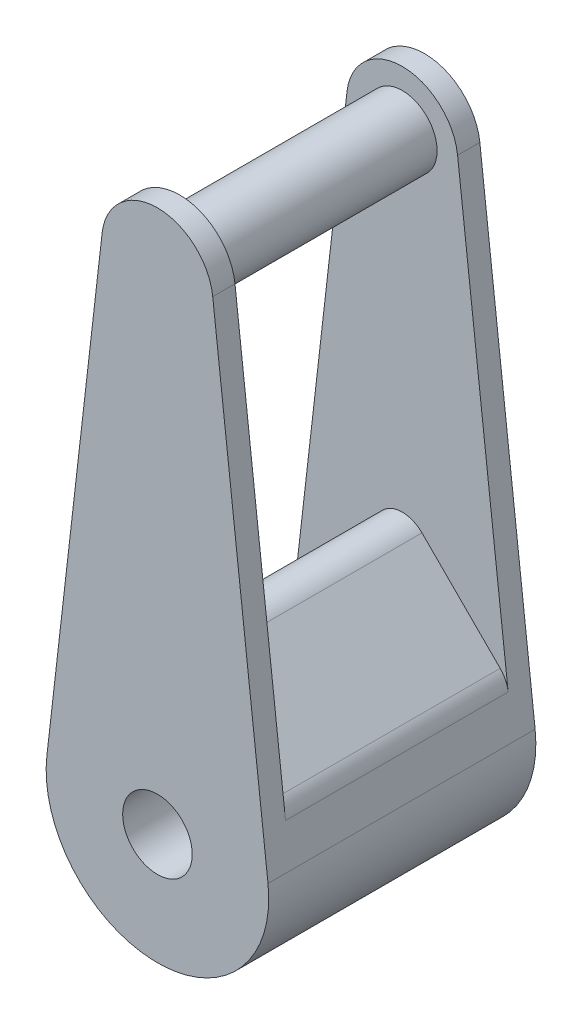
ISO-10303-21;
HEADER;
FILE_DESCRIPTION(('STEP AP214'),'2;1');
FILE_NAME('part.step','',(''),(''),'','','');
FILE_SCHEMA(('AUTOMOTIVE_DESIGN { 1 0 10303 214 1 1 1 1 }'));
ENDSEC;
DATA;
#1=APPLICATION_CONTEXT('core data for automotive mechanical design processes');
#2=APPLICATION_PROTOCOL_DEFINITION('international standard','automotive_design',2000,#1);
#3=PRODUCT_CONTEXT('',#1,'mechanical');
#4=PRODUCT('Part','Part','',(#3));
#5=PRODUCT_RELATED_PRODUCT_CATEGORY('part','',(#4));
#6=PRODUCT_DEFINITION_FORMATION('','',#4);
#7=PRODUCT_DEFINITION_CONTEXT('part definition',#1,'design');
#8=PRODUCT_DEFINITION('design','',#6,#7);
#9=PRODUCT_DEFINITION_SHAPE('','',#8);
#10=(LENGTH_UNIT() NAMED_UNIT(*) SI_UNIT(.MILLI.,.METRE.));
#11=(NAMED_UNIT(*) PLANE_ANGLE_UNIT() SI_UNIT($,.RADIAN.));
#12=(NAMED_UNIT(*) SI_UNIT($,.STERADIAN.) SOLID_ANGLE_UNIT());
#13=UNCERTAINTY_MEASURE_WITH_UNIT(LENGTH_MEASURE(1.E-05),#10,'distance_accuracy_value','');
#14=(GEOMETRIC_REPRESENTATION_CONTEXT(3) GLOBAL_UNCERTAINTY_ASSIGNED_CONTEXT((#13)) GLOBAL_UNIT_ASSIGNED_CONTEXT((#10,
#11,#12)) REPRESENTATION_CONTEXT('',''));
#15=CARTESIAN_POINT('',(0.,0.,0.));
#16=DIRECTION('',(0.,0.,1.));
#17=DIRECTION('',(1.,0.,0.));
#18=AXIS2_PLACEMENT_3D('',#15,#16,#17);
#19=CARTESIAN_POINT('',(0.,0.,40.));
#20=DIRECTION('',(0.,0.,1.));
#21=DIRECTION('',(1.,0.,0.));
#22=AXIS2_PLACEMENT_3D('',#19,#20,#21);
#23=PLANE('',#22);
#24=CARTESIAN_POINT('',(0.,0.,40.));
#25=DIRECTION('',(0.,0.,1.));
#26=DIRECTION('',(1.,0.,0.));
#27=AXIS2_PLACEMENT_3D('',#24,#25,#26);
#28=CIRCLE('',#27,12.5);
#29=CARTESIAN_POINT('',(12.5,0.,40.));
#30=VERTEX_POINT('',#29);
#31=EDGE_CURVE('E11',#30,#30,#28,.T.);
#32=ORIENTED_EDGE('',*,*,#31,.T.);
#33=EDGE_LOOP('',(#32));
#34=FACE_BOUND('',#33,.T.);
#35=CARTESIAN_POINT('',(-28.1068870206755,-156.823874635897,40.));
#36=DIRECTION('',(0.,0.,1.));
#37=DIRECTION('',(1.,0.,0.));
#38=AXIS2_PLACEMENT_3D('',#35,#36,#37);
#39=CIRCLE('',#38,10.);
#40=CARTESIAN_POINT('',(-35.1779548325411,-149.752806824032,40.));
#41=VERTEX_POINT('',#40);
#42=CARTESIAN_POINT('',(-38.0413662496548,-155.68101749304,40.));
#43=VERTEX_POINT('',#42);
#44=EDGE_CURVE('E132',#41,#43,#39,.T.);
#45=ORIENTED_EDGE('',*,*,#44,.T.);
#46=DIRECTION('',(-0.114285714285714,-0.993447922897926,0.));
#47=VECTOR('',#46,1.);
#48=CARTESIAN_POINT('',(-19.8689584579585,2.28571428571428,40.));
#49=LINE('',#48,#47);
#50=CARTESIAN_POINT('',(-19.8689584579585,2.28571428571428,40.));
#51=VERTEX_POINT('',#50);
#52=EDGE_CURVE('E204',#51,#43,#49,.T.);
#53=ORIENTED_EDGE('',*,*,#52,.F.);
#54=CARTESIAN_POINT('',(0.,0.,40.));
#55=DIRECTION('',(0.,0.,1.));
#56=DIRECTION('',(1.,0.,0.));
#57=AXIS2_PLACEMENT_3D('',#54,#55,#56);
#58=CIRCLE('',#57,20.);
#59=CARTESIAN_POINT('',(19.8689584579585,2.28571428571429,40.));
#60=VERTEX_POINT('',#59);
#61=EDGE_CURVE('E201',#60,#51,#58,.T.);
#62=ORIENTED_EDGE('',*,*,#61,.F.);
#63=DIRECTION('',(0.114285714285714,-0.993447922897926,0.));
#64=VECTOR('',#63,1.);
#65=CARTESIAN_POINT('',(19.8689584579585,2.28571428571429,40.));
#66=LINE('',#65,#64);
#67=CARTESIAN_POINT('',(38.0413662496548,-155.68101749304,40.));
#68=VERTEX_POINT('',#67);
#69=EDGE_CURVE('E127',#60,#68,#66,.T.);
#70=ORIENTED_EDGE('',*,*,#69,.T.);
#71=CARTESIAN_POINT('',(28.1068870206755,-156.823874635897,40.));
#72=DIRECTION('',(0.,0.,1.));
#73=DIRECTION('',(1.,0.,0.));
#74=AXIS2_PLACEMENT_3D('',#71,#72,#73);
#75=CIRCLE('',#74,10.);
#76=CARTESIAN_POINT('',(35.1779548325411,-149.752806824032,40.));
#77=VERTEX_POINT('',#76);
#78=EDGE_CURVE('E120',#68,#77,#75,.T.);
#79=ORIENTED_EDGE('',*,*,#78,.T.);
#80=DIRECTION('',(-0.707106781186542,0.707106781186553,0.));
#81=VECTOR('',#80,1.);
#82=CARTESIAN_POINT('',(7.07106781186553,-121.645919803356,40.));
#83=LINE('',#82,#81);
#84=CARTESIAN_POINT('',(7.07106781186555,-121.645919803356,40.));
#85=VERTEX_POINT('',#84);
#86=EDGE_CURVE('E123',#77,#85,#83,.T.);
#87=ORIENTED_EDGE('',*,*,#86,.T.);
#88=CARTESIAN_POINT('',(0.,-128.716987615221,40.));
#89=DIRECTION('',(0.,0.,1.));
#90=DIRECTION('',(1.,0.,0.));
#91=AXIS2_PLACEMENT_3D('',#88,#89,#90);
#92=CIRCLE('',#91,9.99999999999999);
#93=CARTESIAN_POINT('',(-7.07106781186553,-121.645919803356,40.));
#94=VERTEX_POINT('',#93);
#95=EDGE_CURVE('E55',#85,#94,#92,.T.);
#96=ORIENTED_EDGE('',*,*,#95,.T.);
#97=DIRECTION('',(-0.707106781186541,-0.707106781186554,0.));
#98=VECTOR('',#97,1.);
#99=CARTESIAN_POINT('',(-7.07106781186553,-121.645919803356,40.));
#100=LINE('',#99,#98);
#101=EDGE_CURVE('E50',#94,#41,#100,.T.);
#102=ORIENTED_EDGE('',*,*,#101,.T.);
#103=EDGE_LOOP('',(#45,#53,#62,#70,#79,#87,#96,#102));
#104=FACE_BOUND('',#103,.T.);
#105=ADVANCED_FACE('F34',(#34,#104),#23,.F.);
#106=CARTESIAN_POINT('',(0.,0.,-40.));
#107=DIRECTION('',(0.,0.,-1.));
#108=DIRECTION('',(1.,0.,0.));
#109=AXIS2_PLACEMENT_3D('',#106,#107,#108);
#110=PLANE('',#109);
#111=CARTESIAN_POINT('',(0.,0.,-40.));
#112=DIRECTION('',(0.,0.,1.));
#113=DIRECTION('',(1.,0.,0.));
#114=AXIS2_PLACEMENT_3D('',#111,#112,#113);
#115=CIRCLE('',#114,12.5);
#116=CARTESIAN_POINT('',(12.5,0.,-40.));
#117=VERTEX_POINT('',#116);
#118=EDGE_CURVE('E38',#117,#117,#115,.T.);
#119=ORIENTED_EDGE('',*,*,#118,.F.);
#120=EDGE_LOOP('',(#119));
#121=FACE_BOUND('',#120,.T.);
#122=CARTESIAN_POINT('',(-28.1068870206755,-156.823874635897,-40.));
#123=DIRECTION('',(0.,0.,1.));
#124=DIRECTION('',(-1.,0.,0.));
#125=AXIS2_PLACEMENT_3D('',#122,#123,#124);
#126=CIRCLE('',#125,10.);
#127=CARTESIAN_POINT('',(-35.1779548325411,-149.752806824032,-40.));
#128=VERTEX_POINT('',#127);
#129=CARTESIAN_POINT('',(-38.0413662496548,-155.68101749304,-40.));
#130=VERTEX_POINT('',#129);
#131=EDGE_CURVE('E159',#128,#130,#126,.T.);
#132=ORIENTED_EDGE('',*,*,#131,.F.);
#133=DIRECTION('',(-0.707106781186541,-0.707106781186554,0.));
#134=VECTOR('',#133,1.);
#135=CARTESIAN_POINT('',(-7.07106781186553,-121.645919803356,-40.));
#136=LINE('',#135,#134);
#137=CARTESIAN_POINT('',(-7.07106781186553,-121.645919803356,-40.));
#138=VERTEX_POINT('',#137);
#139=EDGE_CURVE('E154',#138,#128,#136,.T.);
#140=ORIENTED_EDGE('',*,*,#139,.F.);
#141=CARTESIAN_POINT('',(0.,-128.716987615221,-40.));
#142=DIRECTION('',(0.,0.,1.));
#143=DIRECTION('',(1.,0.,0.));
#144=AXIS2_PLACEMENT_3D('',#141,#142,#143);
#145=CIRCLE('',#144,9.99999999999999);
#146=CARTESIAN_POINT('',(7.07106781186553,-121.645919803356,-40.));
#147=VERTEX_POINT('',#146);
#148=EDGE_CURVE('E155',#147,#138,#145,.T.);
#149=ORIENTED_EDGE('',*,*,#148,.F.);
#150=DIRECTION('',(-0.707106781186542,0.707106781186553,0.));
#151=VECTOR('',#150,1.);
#152=CARTESIAN_POINT('',(7.07106781186553,-121.645919803356,-40.));
#153=LINE('',#152,#151);
#154=CARTESIAN_POINT('',(35.1779548325411,-149.752806824032,-40.));
#155=VERTEX_POINT('',#154);
#156=EDGE_CURVE('E141',#155,#147,#153,.T.);
#157=ORIENTED_EDGE('',*,*,#156,.F.);
#158=CARTESIAN_POINT('',(28.1068870206755,-156.823874635897,-40.));
#159=DIRECTION('',(0.,0.,1.));
#160=DIRECTION('',(1.,0.,0.));
#161=AXIS2_PLACEMENT_3D('',#158,#159,#160);
#162=CIRCLE('',#161,10.);
#163=CARTESIAN_POINT('',(38.0413662496548,-155.68101749304,-40.));
#164=VERTEX_POINT('',#163);
#165=EDGE_CURVE('E138',#164,#155,#162,.T.);
#166=ORIENTED_EDGE('',*,*,#165,.F.);
#167=DIRECTION('',(0.114285714285714,-0.993447922897926,0.));
#168=VECTOR('',#167,1.);
#169=CARTESIAN_POINT('',(19.8689584579585,2.28571428571429,-40.));
#170=LINE('',#169,#168);
#171=CARTESIAN_POINT('',(19.8689584579585,2.28571428571429,-40.));
#172=VERTEX_POINT('',#171);
#173=EDGE_CURVE('E183',#172,#164,#170,.T.);
#174=ORIENTED_EDGE('',*,*,#173,.F.);
#175=CARTESIAN_POINT('',(0.,0.,-40.));
#176=DIRECTION('',(0.,0.,1.));
#177=DIRECTION('',(1.,0.,0.));
#178=AXIS2_PLACEMENT_3D('',#175,#176,#177);
#179=CIRCLE('',#178,20.);
#180=CARTESIAN_POINT('',(-19.8689584579585,2.28571428571428,-40.));
#181=VERTEX_POINT('',#180);
#182=EDGE_CURVE('E131',#172,#181,#179,.T.);
#183=ORIENTED_EDGE('',*,*,#182,.T.);
#184=DIRECTION('',(-0.114285714285714,-0.993447922897926,0.));
#185=VECTOR('',#184,1.);
#186=CARTESIAN_POINT('',(-19.8689584579585,2.28571428571428,-40.));
#187=LINE('',#186,#185);
#188=EDGE_CURVE('E171',#181,#130,#187,.T.);
#189=ORIENTED_EDGE('',*,*,#188,.T.);
#190=EDGE_LOOP('',(#132,#140,#149,#157,#166,#174,#183,#189));
#191=FACE_BOUND('',#190,.T.);
#192=ADVANCED_FACE('F228',(#121,#191),#110,.F.);
#193=CARTESIAN_POINT('',(0.,0.,40.));
#194=DIRECTION('',(0.,0.,-1.));
#195=DIRECTION('',(-1.,0.,0.));
#196=AXIS2_PLACEMENT_3D('',#193,#194,#195);
#197=CYLINDRICAL_SURFACE('',#196,12.5);
#198=ORIENTED_EDGE('',*,*,#31,.F.);
#199=EDGE_LOOP('',(#198));
#200=FACE_BOUND('',#199,.T.);
#201=ORIENTED_EDGE('',*,*,#118,.T.);
#202=EDGE_LOOP('',(#201));
#203=FACE_BOUND('',#202,.T.);
#204=ADVANCED_FACE('F36',(#200,#203),#197,.T.);
#205=CARTESIAN_POINT('',(0.,0.,48.));
#206=DIRECTION('',(0.,0.,-1.));
#207=DIRECTION('',(-1.,0.,0.));
#208=AXIS2_PLACEMENT_3D('',#205,#206,#207);
#209=CYLINDRICAL_SURFACE('',#208,20.);
#210=ORIENTED_EDGE('',*,*,#61,.T.);
#211=DIRECTION('',(0.,0.,-1.));
#212=VECTOR('',#211,1.);
#213=CARTESIAN_POINT('',(-19.8689584579585,2.28571428571428,48.));
#214=LINE('',#213,#212);
#215=CARTESIAN_POINT('',(-19.8689584579585,2.28571428571428,48.));
#216=VERTEX_POINT('',#215);
#217=EDGE_CURVE('E43',#216,#51,#214,.T.);
#218=ORIENTED_EDGE('',*,*,#217,.F.);
#219=CARTESIAN_POINT('',(0.,0.,48.));
#220=DIRECTION('',(0.,0.,1.));
#221=DIRECTION('',(1.,0.,0.));
#222=AXIS2_PLACEMENT_3D('',#219,#220,#221);
#223=CIRCLE('',#222,20.);
#224=CARTESIAN_POINT('',(19.8689584579585,2.28571428571429,48.));
#225=VERTEX_POINT('',#224);
#226=EDGE_CURVE('E190',#225,#216,#223,.T.);
#227=ORIENTED_EDGE('',*,*,#226,.F.);
#228=DIRECTION('',(0.,0.,-1.));
#229=VECTOR('',#228,1.);
#230=CARTESIAN_POINT('',(19.8689584579585,2.28571428571429,48.));
#231=LINE('',#230,#229);
#232=EDGE_CURVE('E200',#225,#60,#231,.T.);
#233=ORIENTED_EDGE('',*,*,#232,.T.);
#234=EDGE_LOOP('',(#210,#218,#227,#233));
#235=FACE_BOUND('',#234,.T.);
#236=ADVANCED_FACE('F221',(#235),#209,.T.);
#237=CARTESIAN_POINT('',(-19.8689584579585,2.28571428571428,48.));
#238=DIRECTION('',(0.993447922897926,-0.114285714285714,0.));
#239=DIRECTION('',(0.114285714285714,0.993447922897926,0.));
#240=AXIS2_PLACEMENT_3D('',#237,#238,#239);
#241=PLANE('',#240);
#242=ORIENTED_EDGE('',*,*,#52,.T.);
#243=DIRECTION('',(0.,0.,-1.));
#244=VECTOR('',#243,1.);
#245=CARTESIAN_POINT('',(-38.0413662496548,-155.68101749304,165.181542065464));
#246=LINE('',#245,#244);
#247=EDGE_CURVE('E160',#43,#130,#246,.T.);
#248=ORIENTED_EDGE('',*,*,#247,.T.);
#249=ORIENTED_EDGE('',*,*,#188,.F.);
#250=DIRECTION('',(0.,0.,1.));
#251=VECTOR('',#250,1.);
#252=CARTESIAN_POINT('',(-19.8689584579585,2.28571428571428,-48.));
#253=LINE('',#252,#251);
#254=CARTESIAN_POINT('',(-19.8689584579585,2.28571428571428,-48.));
#255=VERTEX_POINT('',#254);
#256=EDGE_CURVE('E180',#255,#181,#253,.T.);
#257=ORIENTED_EDGE('',*,*,#256,.F.);
#258=DIRECTION('',(-0.114285714285714,-0.993447922897926,0.));
#259=VECTOR('',#258,1.);
#260=CARTESIAN_POINT('',(-19.8689584579585,2.28571428571428,-48.));
#261=LINE('',#260,#259);
#262=CARTESIAN_POINT('',(-39.737916915917,-170.428571428571,-48.));
#263=VERTEX_POINT('',#262);
#264=EDGE_CURVE('E177',#255,#263,#261,.T.);
#265=ORIENTED_EDGE('',*,*,#264,.T.);
#266=DIRECTION('',(0.,0.,-1.));
#267=VECTOR('',#266,1.);
#268=CARTESIAN_POINT('',(-39.737916915917,-170.428571428571,48.));
#269=LINE('',#268,#267);
#270=CARTESIAN_POINT('',(-39.737916915917,-170.428571428571,48.));
#271=VERTEX_POINT('',#270);
#272=EDGE_CURVE('E211',#271,#263,#269,.T.);
#273=ORIENTED_EDGE('',*,*,#272,.F.);
#274=DIRECTION('',(-0.114285714285714,-0.993447922897926,0.));
#275=VECTOR('',#274,1.);
#276=CARTESIAN_POINT('',(-19.8689584579585,2.28571428571428,48.));
#277=LINE('',#276,#275);
#278=EDGE_CURVE('E193',#216,#271,#277,.T.);
#279=ORIENTED_EDGE('',*,*,#278,.F.);
#280=ORIENTED_EDGE('',*,*,#217,.T.);
#281=EDGE_LOOP('',(#242,#248,#249,#257,#265,#273,#279,#280));
#282=FACE_BOUND('',#281,.T.);
#283=ADVANCED_FACE('F216',(#282),#241,.F.);
#284=CARTESIAN_POINT('',(0.,-175.,48.));
#285=DIRECTION('',(0.,0.,-1.));
#286=DIRECTION('',(-1.,0.,0.));
#287=AXIS2_PLACEMENT_3D('',#284,#285,#286);
#288=CYLINDRICAL_SURFACE('',#287,40.);
#289=ORIENTED_EDGE('',*,*,#272,.T.);
#290=CARTESIAN_POINT('',(0.,-175.,-48.));
#291=DIRECTION('',(0.,0.,1.));
#292=DIRECTION('',(1.,0.,0.));
#293=AXIS2_PLACEMENT_3D('',#290,#291,#292);
#294=CIRCLE('',#293,40.);
#295=CARTESIAN_POINT('',(39.737916915917,-170.428571428571,-48.));
#296=VERTEX_POINT('',#295);
#297=EDGE_CURVE('E174',#263,#296,#294,.T.);
#298=ORIENTED_EDGE('',*,*,#297,.T.);
#299=DIRECTION('',(0.,0.,-1.));
#300=VECTOR('',#299,1.);
#301=CARTESIAN_POINT('',(39.737916915917,-170.428571428571,48.));
#302=LINE('',#301,#300);
#303=CARTESIAN_POINT('',(39.737916915917,-170.428571428571,48.));
#304=VERTEX_POINT('',#303);
#305=EDGE_CURVE('E209',#304,#296,#302,.T.);
#306=ORIENTED_EDGE('',*,*,#305,.F.);
#307=CARTESIAN_POINT('',(0.,-175.,48.));
#308=DIRECTION('',(0.,0.,1.));
#309=DIRECTION('',(1.,0.,0.));
#310=AXIS2_PLACEMENT_3D('',#307,#308,#309);
#311=CIRCLE('',#310,40.);
#312=EDGE_CURVE('E195',#271,#304,#311,.T.);
#313=ORIENTED_EDGE('',*,*,#312,.F.);
#314=EDGE_LOOP('',(#289,#298,#306,#313));
#315=FACE_BOUND('',#314,.T.);
#316=ADVANCED_FACE('F274',(#315),#288,.T.);
#317=CARTESIAN_POINT('',(19.8689584579585,2.28571428571429,48.));
#318=DIRECTION('',(0.993447922897926,0.114285714285714,0.));
#319=DIRECTION('',(-0.114285714285714,0.993447922897926,0.));
#320=AXIS2_PLACEMENT_3D('',#317,#318,#319);
#321=PLANE('',#320);
#322=ORIENTED_EDGE('',*,*,#69,.F.);
#323=ORIENTED_EDGE('',*,*,#232,.F.);
#324=DIRECTION('',(0.114285714285714,-0.993447922897926,0.));
#325=VECTOR('',#324,1.);
#326=CARTESIAN_POINT('',(19.8689584579585,2.28571428571429,48.));
#327=LINE('',#326,#325);
#328=EDGE_CURVE('E197',#225,#304,#327,.T.);
#329=ORIENTED_EDGE('',*,*,#328,.T.);
#330=ORIENTED_EDGE('',*,*,#305,.T.);
#331=DIRECTION('',(0.114285714285714,-0.993447922897926,0.));
#332=VECTOR('',#331,1.);
#333=CARTESIAN_POINT('',(19.8689584579585,2.28571428571429,-48.));
#334=LINE('',#333,#332);
#335=CARTESIAN_POINT('',(19.8689584579585,2.28571428571429,-48.));
#336=VERTEX_POINT('',#335);
#337=EDGE_CURVE('E170',#336,#296,#334,.T.);
#338=ORIENTED_EDGE('',*,*,#337,.F.);
#339=DIRECTION('',(0.,0.,1.));
#340=VECTOR('',#339,1.);
#341=CARTESIAN_POINT('',(19.8689584579585,2.28571428571429,-48.));
#342=LINE('',#341,#340);
#343=EDGE_CURVE('E188',#336,#172,#342,.T.);
#344=ORIENTED_EDGE('',*,*,#343,.T.);
#345=ORIENTED_EDGE('',*,*,#173,.T.);
#346=DIRECTION('',(0.,0.,-1.));
#347=VECTOR('',#346,1.);
#348=CARTESIAN_POINT('',(38.0413662496548,-155.68101749304,165.181542065464));
#349=LINE('',#348,#347);
#350=EDGE_CURVE('E163',#68,#164,#349,.T.);
#351=ORIENTED_EDGE('',*,*,#350,.F.);
#352=EDGE_LOOP('',(#322,#323,#329,#330,#338,#344,#345,#351));
#353=FACE_BOUND('',#352,.T.);
#354=ADVANCED_FACE('F223',(#353),#321,.T.);
#355=CARTESIAN_POINT('',(0.,0.,48.));
#356=DIRECTION('',(0.,0.,1.));
#357=DIRECTION('',(1.,0.,0.));
#358=AXIS2_PLACEMENT_3D('',#355,#356,#357);
#359=PLANE('',#358);
#360=CARTESIAN_POINT('',(0.,-175.,48.));
#361=DIRECTION('',(0.,0.,1.));
#362=DIRECTION('',(1.,0.,0.));
#363=AXIS2_PLACEMENT_3D('',#360,#361,#362);
#364=CIRCLE('',#363,12.5);
#365=CARTESIAN_POINT('',(12.5,-175.,48.));
#366=VERTEX_POINT('',#365);
#367=EDGE_CURVE('E166',#366,#366,#364,.F.);
#368=ORIENTED_EDGE('',*,*,#367,.T.);
#369=EDGE_LOOP('',(#368));
#370=FACE_BOUND('',#369,.T.);
#371=ORIENTED_EDGE('',*,*,#226,.T.);
#372=ORIENTED_EDGE('',*,*,#278,.T.);
#373=ORIENTED_EDGE('',*,*,#312,.T.);
#374=ORIENTED_EDGE('',*,*,#328,.F.);
#375=EDGE_LOOP('',(#371,#372,#373,#374));
#376=FACE_BOUND('',#375,.T.);
#377=ADVANCED_FACE('F270',(#370,#376),#359,.T.);
#378=CARTESIAN_POINT('',(0.,0.,-48.));
#379=DIRECTION('',(0.,0.,1.));
#380=DIRECTION('',(1.,0.,0.));
#381=AXIS2_PLACEMENT_3D('',#378,#379,#380);
#382=CYLINDRICAL_SURFACE('',#381,20.);
#383=ORIENTED_EDGE('',*,*,#182,.F.);
#384=ORIENTED_EDGE('',*,*,#343,.F.);
#385=CARTESIAN_POINT('',(0.,0.,-48.));
#386=DIRECTION('',(0.,0.,1.));
#387=DIRECTION('',(1.,0.,0.));
#388=AXIS2_PLACEMENT_3D('',#385,#386,#387);
#389=CIRCLE('',#388,20.);
#390=EDGE_CURVE('E167',#336,#255,#389,.T.);
#391=ORIENTED_EDGE('',*,*,#390,.T.);
#392=ORIENTED_EDGE('',*,*,#256,.T.);
#393=EDGE_LOOP('',(#383,#384,#391,#392));
#394=FACE_BOUND('',#393,.T.);
#395=ADVANCED_FACE('F231',(#394),#382,.T.);
#396=CARTESIAN_POINT('',(0.,0.,-48.));
#397=DIRECTION('',(0.,0.,-1.));
#398=DIRECTION('',(1.,0.,0.));
#399=AXIS2_PLACEMENT_3D('',#396,#397,#398);
#400=PLANE('',#399);
#401=CARTESIAN_POINT('',(0.,-175.,-48.));
#402=DIRECTION('',(0.,0.,-1.));
#403=DIRECTION('',(-1.,0.,0.));
#404=AXIS2_PLACEMENT_3D('',#401,#402,#403);
#405=CIRCLE('',#404,12.5);
#406=CARTESIAN_POINT('',(-12.5,-175.,-48.));
#407=VERTEX_POINT('',#406);
#408=EDGE_CURVE('E386',#407,#407,#405,.T.);
#409=ORIENTED_EDGE('',*,*,#408,.F.);
#410=EDGE_LOOP('',(#409));
#411=FACE_BOUND('',#410,.T.);
#412=ORIENTED_EDGE('',*,*,#390,.F.);
#413=ORIENTED_EDGE('',*,*,#337,.T.);
#414=ORIENTED_EDGE('',*,*,#297,.F.);
#415=ORIENTED_EDGE('',*,*,#264,.F.);
#416=EDGE_LOOP('',(#412,#413,#414,#415));
#417=FACE_BOUND('',#416,.T.);
#418=ADVANCED_FACE('F251',(#411,#417),#400,.T.);
#419=CARTESIAN_POINT('',(0.,-128.716987615221,165.181542065464));
#420=DIRECTION('',(0.,0.,-1.));
#421=DIRECTION('',(-1.,0.,0.));
#422=AXIS2_PLACEMENT_3D('',#419,#420,#421);
#423=CYLINDRICAL_SURFACE('',#422,9.99999999999999);
#424=ORIENTED_EDGE('',*,*,#95,.F.);
#425=DIRECTION('',(0.,0.,-1.));
#426=VECTOR('',#425,1.);
#427=CARTESIAN_POINT('',(7.07106781186553,-121.645919803356,165.181542065464));
#428=LINE('',#427,#426);
#429=EDGE_CURVE('E145',#85,#147,#428,.T.);
#430=ORIENTED_EDGE('',*,*,#429,.T.);
#431=ORIENTED_EDGE('',*,*,#148,.T.);
#432=DIRECTION('',(0.,0.,-1.));
#433=VECTOR('',#432,1.);
#434=CARTESIAN_POINT('',(-7.07106781186553,-121.645919803356,165.181542065464));
#435=LINE('',#434,#433);
#436=EDGE_CURVE('E151',#94,#138,#435,.T.);
#437=ORIENTED_EDGE('',*,*,#436,.F.);
#438=EDGE_LOOP('',(#424,#430,#431,#437));
#439=FACE_BOUND('',#438,.T.);
#440=ADVANCED_FACE('F249',(#439),#423,.T.);
#441=CARTESIAN_POINT('',(-7.07106781186553,-121.645919803356,165.181542065464));
#442=DIRECTION('',(0.707106781186554,-0.707106781186541,0.));
#443=DIRECTION('',(0.707106781186541,0.707106781186554,0.));
#444=AXIS2_PLACEMENT_3D('',#441,#442,#443);
#445=PLANE('',#444);
#446=ORIENTED_EDGE('',*,*,#101,.F.);
#447=ORIENTED_EDGE('',*,*,#436,.T.);
#448=ORIENTED_EDGE('',*,*,#139,.T.);
#449=DIRECTION('',(0.,0.,-1.));
#450=VECTOR('',#449,1.);
#451=CARTESIAN_POINT('',(-35.1779548325411,-149.752806824032,165.181542065464));
#452=LINE('',#451,#450);
#453=EDGE_CURVE('E156',#41,#128,#452,.T.);
#454=ORIENTED_EDGE('',*,*,#453,.F.);
#455=EDGE_LOOP('',(#446,#447,#448,#454));
#456=FACE_BOUND('',#455,.T.);
#457=ADVANCED_FACE('F241',(#456),#445,.F.);
#458=CARTESIAN_POINT('',(-28.1068870206755,-156.823874635897,165.181542065464));
#459=DIRECTION('',(0.,0.,-1.));
#460=DIRECTION('',(-1.,0.,0.));
#461=AXIS2_PLACEMENT_3D('',#458,#459,#460);
#462=CYLINDRICAL_SURFACE('',#461,10.);
#463=ORIENTED_EDGE('',*,*,#44,.F.);
#464=ORIENTED_EDGE('',*,*,#453,.T.);
#465=ORIENTED_EDGE('',*,*,#131,.T.);
#466=ORIENTED_EDGE('',*,*,#247,.F.);
#467=EDGE_LOOP('',(#463,#464,#465,#466));
#468=FACE_BOUND('',#467,.T.);
#469=ADVANCED_FACE('F239',(#468),#462,.T.);
#470=CARTESIAN_POINT('',(28.1068870206755,-156.823874635897,165.181542065464));
#471=DIRECTION('',(0.,0.,-1.));
#472=DIRECTION('',(-1.,0.,0.));
#473=AXIS2_PLACEMENT_3D('',#470,#471,#472);
#474=CYLINDRICAL_SURFACE('',#473,10.);
#475=ORIENTED_EDGE('',*,*,#78,.F.);
#476=ORIENTED_EDGE('',*,*,#350,.T.);
#477=ORIENTED_EDGE('',*,*,#165,.T.);
#478=DIRECTION('',(0.,0.,-1.));
#479=VECTOR('',#478,1.);
#480=CARTESIAN_POINT('',(35.1779548325411,-149.752806824032,165.181542065464));
#481=LINE('',#480,#479);
#482=EDGE_CURVE('E136',#77,#155,#481,.T.);
#483=ORIENTED_EDGE('',*,*,#482,.F.);
#484=EDGE_LOOP('',(#475,#476,#477,#483));
#485=FACE_BOUND('',#484,.T.);
#486=ADVANCED_FACE('F137',(#485),#474,.T.);
#487=CARTESIAN_POINT('',(7.07106781186553,-121.645919803356,165.181542065464));
#488=DIRECTION('',(-0.707106781186553,-0.707106781186542,0.));
#489=DIRECTION('',(0.707106781186542,-0.707106781186553,0.));
#490=AXIS2_PLACEMENT_3D('',#487,#488,#489);
#491=PLANE('',#490);
#492=ORIENTED_EDGE('',*,*,#86,.F.);
#493=ORIENTED_EDGE('',*,*,#482,.T.);
#494=ORIENTED_EDGE('',*,*,#156,.T.);
#495=ORIENTED_EDGE('',*,*,#429,.F.);
#496=EDGE_LOOP('',(#492,#493,#494,#495));
#497=FACE_BOUND('',#496,.T.);
#498=ADVANCED_FACE('F143',(#497),#491,.F.);
#499=CARTESIAN_POINT('',(0.,-175.,83.3553390593274));
#500=DIRECTION('',(0.,0.,-1.));
#501=DIRECTION('',(-1.,0.,0.));
#502=AXIS2_PLACEMENT_3D('',#499,#500,#501);
#503=CYLINDRICAL_SURFACE('',#502,12.5);
#504=ORIENTED_EDGE('',*,*,#408,.T.);
#505=EDGE_LOOP('',(#504));
#506=FACE_BOUND('',#505,.T.);
#507=ORIENTED_EDGE('',*,*,#367,.F.);
#508=EDGE_LOOP('',(#507));
#509=FACE_BOUND('',#508,.T.);
#510=ADVANCED_FACE('F355',(#506,#509),#503,.F.);
#511=CLOSED_SHELL('',(#105,#192,#204,#236,#283,#316,#354,#377,#395,#418,#440,#457,#469,#486,
#498,#510));
#512=MANIFOLD_SOLID_BREP('B2',#511);
#513=ADVANCED_BREP_SHAPE_REPRESENTATION('',(#18,#512),#14);
#514=SHAPE_DEFINITION_REPRESENTATION(#9,#513);
ENDSEC;
END-ISO-10303-21;
